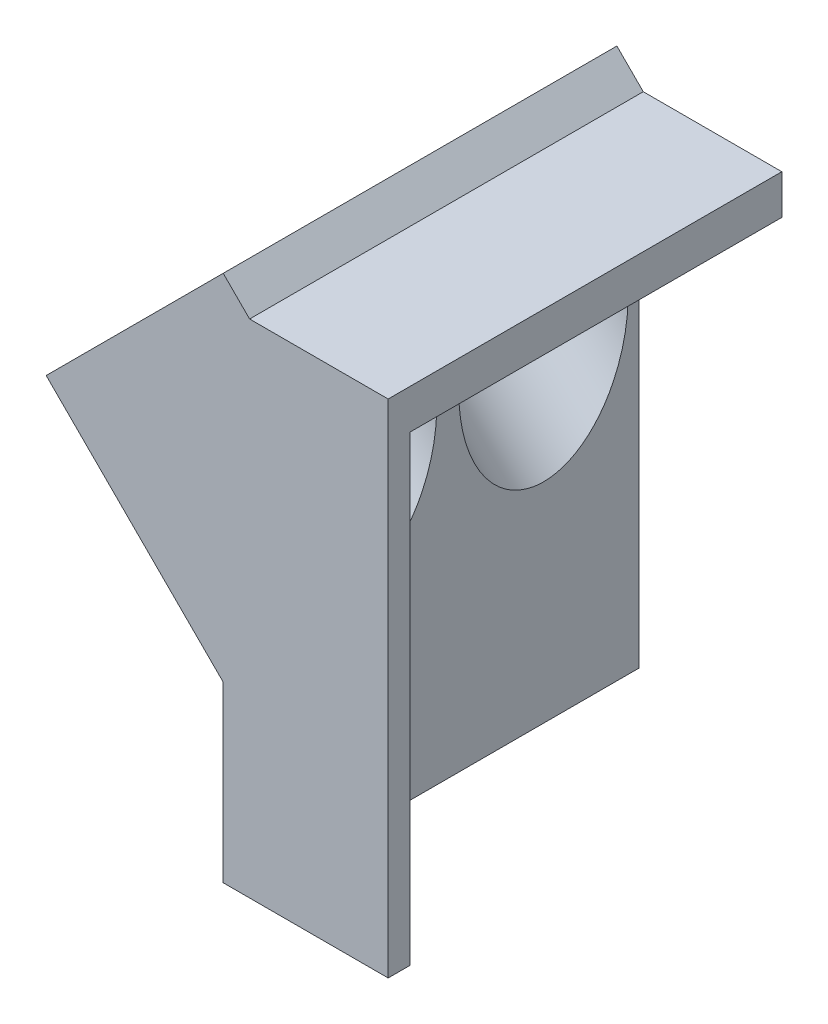
ISO-10303-21;
HEADER;
FILE_DESCRIPTION(('STEP AP214'),'2;1');
FILE_NAME('part.step','',(''),(''),'','','');
FILE_SCHEMA(('AUTOMOTIVE_DESIGN { 1 0 10303 214 1 1 1 1 }'));
ENDSEC;
DATA;
#1=APPLICATION_CONTEXT('core data for automotive mechanical design processes');
#2=APPLICATION_PROTOCOL_DEFINITION('international standard','automotive_design',2000,#1);
#3=PRODUCT_CONTEXT('',#1,'mechanical');
#4=PRODUCT('Part','Part','',(#3));
#5=PRODUCT_RELATED_PRODUCT_CATEGORY('part','',(#4));
#6=PRODUCT_DEFINITION_FORMATION('','',#4);
#7=PRODUCT_DEFINITION_CONTEXT('part definition',#1,'design');
#8=PRODUCT_DEFINITION('design','',#6,#7);
#9=PRODUCT_DEFINITION_SHAPE('','',#8);
#10=(LENGTH_UNIT() NAMED_UNIT(*) SI_UNIT(.MILLI.,.METRE.));
#11=(NAMED_UNIT(*) PLANE_ANGLE_UNIT() SI_UNIT($,.RADIAN.));
#12=(NAMED_UNIT(*) SI_UNIT($,.STERADIAN.) SOLID_ANGLE_UNIT());
#13=UNCERTAINTY_MEASURE_WITH_UNIT(LENGTH_MEASURE(1.E-05),#10,'distance_accuracy_value','');
#14=(GEOMETRIC_REPRESENTATION_CONTEXT(3) GLOBAL_UNCERTAINTY_ASSIGNED_CONTEXT((#13)) GLOBAL_UNIT_ASSIGNED_CONTEXT((#10,
#11,#12)) REPRESENTATION_CONTEXT('',''));
#15=CARTESIAN_POINT('',(0.,0.,0.));
#16=DIRECTION('',(0.,0.,1.));
#17=DIRECTION('',(1.,0.,0.));
#18=AXIS2_PLACEMENT_3D('',#15,#16,#17);
#19=CARTESIAN_POINT('',(103.,0.,0.));
#20=DIRECTION('',(1.,0.,0.));
#21=DIRECTION('',(0.,0.,-1.));
#22=AXIS2_PLACEMENT_3D('',#19,#20,#21);
#23=PLANE('',#22);
#24=DIRECTION('',(0.,0.,1.));
#25=VECTOR('',#24,1.);
#26=CARTESIAN_POINT('',(103.,-150.,0.));
#27=LINE('',#26,#25);
#28=CARTESIAN_POINT('',(103.,-150.,169.));
#29=VERTEX_POINT('',#28);
#30=CARTESIAN_POINT('',(103.,-150.,179.));
#31=VERTEX_POINT('',#30);
#32=EDGE_CURVE('E136',#29,#31,#27,.T.);
#33=ORIENTED_EDGE('',*,*,#32,.F.);
#34=DIRECTION('',(0.,1.,0.));
#35=VECTOR('',#34,1.);
#36=CARTESIAN_POINT('',(103.,60.0000000000001,169.));
#37=LINE('',#36,#35);
#38=CARTESIAN_POINT('',(103.,60.0000000000001,169.));
#39=VERTEX_POINT('',#38);
#40=EDGE_CURVE('E137',#29,#39,#37,.T.);
#41=ORIENTED_EDGE('',*,*,#40,.T.);
#42=DIRECTION('',(0.,0.,1.));
#43=VECTOR('',#42,1.);
#44=CARTESIAN_POINT('',(103.,60.0000000000001,0.));
#45=LINE('',#44,#43);
#46=CARTESIAN_POINT('',(103.,60.0000000000001,0.));
#47=VERTEX_POINT('',#46);
#48=EDGE_CURVE('E135',#47,#39,#45,.T.);
#49=ORIENTED_EDGE('',*,*,#48,.F.);
#50=DIRECTION('',(0.,-1.,0.));
#51=VECTOR('',#50,1.);
#52=CARTESIAN_POINT('',(103.,0.,0.));
#53=LINE('',#52,#51);
#54=CARTESIAN_POINT('',(103.,78.0000000000001,0.));
#55=VERTEX_POINT('',#54);
#56=EDGE_CURVE('E122',#55,#47,#53,.T.);
#57=ORIENTED_EDGE('',*,*,#56,.F.);
#58=DIRECTION('',(0.,0.,1.));
#59=VECTOR('',#58,1.);
#60=CARTESIAN_POINT('',(103.,78.0000000000001,0.));
#61=LINE('',#60,#59);
#62=CARTESIAN_POINT('',(103.,78.0000000000001,179.));
#63=VERTEX_POINT('',#62);
#64=EDGE_CURVE('E133',#55,#63,#61,.T.);
#65=ORIENTED_EDGE('',*,*,#64,.T.);
#66=DIRECTION('',(0.,-1.,0.));
#67=VECTOR('',#66,1.);
#68=CARTESIAN_POINT('',(103.,90.0000000000001,179.));
#69=LINE('',#68,#67);
#70=EDGE_CURVE('E143',#63,#31,#69,.T.);
#71=ORIENTED_EDGE('',*,*,#70,.T.);
#72=EDGE_LOOP('',(#33,#41,#49,#57,#65,#71));
#73=FACE_BOUND('',#72,.T.);
#74=ADVANCED_FACE('F42',(#73),#23,.T.);
#75=CARTESIAN_POINT('',(0.,0.,0.));
#76=DIRECTION('',(0.,0.,-1.));
#77=DIRECTION('',(-1.,0.,0.));
#78=AXIS2_PLACEMENT_3D('',#75,#76,#77);
#79=PLANE('',#78);
#80=DIRECTION('',(1.,0.,0.));
#81=VECTOR('',#80,1.);
#82=CARTESIAN_POINT('',(0.,78.0000000000001,0.));
#83=LINE('',#82,#81);
#84=CARTESIAN_POINT('',(39.9999999999998,78.0000000000001,0.));
#85=VERTEX_POINT('',#84);
#86=EDGE_CURVE('E11',#85,#55,#83,.T.);
#87=ORIENTED_EDGE('',*,*,#86,.T.);
#88=ORIENTED_EDGE('',*,*,#56,.T.);
#89=DIRECTION('',(1.,0.,0.));
#90=VECTOR('',#89,1.);
#91=CARTESIAN_POINT('',(0.,60.0000000000001,0.));
#92=LINE('',#91,#90);
#93=CARTESIAN_POINT('',(38.,60.0000000000001,0.));
#94=VERTEX_POINT('',#93);
#95=EDGE_CURVE('E160',#94,#47,#92,.T.);
#96=ORIENTED_EDGE('',*,*,#95,.F.);
#97=DIRECTION('',(0.,1.,0.));
#98=VECTOR('',#97,1.);
#99=CARTESIAN_POINT('',(38.,60.0000000000001,0.));
#100=LINE('',#99,#98);
#101=CARTESIAN_POINT('',(38.,-150.,0.));
#102=VERTEX_POINT('',#101);
#103=EDGE_CURVE('E161',#102,#94,#100,.T.);
#104=ORIENTED_EDGE('',*,*,#103,.F.);
#105=DIRECTION('',(1.,0.,0.));
#106=VECTOR('',#105,1.);
#107=CARTESIAN_POINT('',(0.,-150.,0.));
#108=LINE('',#107,#106);
#109=CARTESIAN_POINT('',(28.,-150.,0.));
#110=VERTEX_POINT('',#109);
#111=EDGE_CURVE('E163',#110,#102,#108,.T.);
#112=ORIENTED_EDGE('',*,*,#111,.F.);
#113=DIRECTION('',(0.,-1.,0.));
#114=VECTOR('',#113,1.);
#115=CARTESIAN_POINT('',(28.,-150.,0.));
#116=LINE('',#115,#114);
#117=CARTESIAN_POINT('',(28.,-71.0000000000006,0.));
#118=VERTEX_POINT('',#117);
#119=EDGE_CURVE('E173',#118,#110,#116,.T.);
#120=ORIENTED_EDGE('',*,*,#119,.F.);
#121=DIRECTION('',(0.707106781186551,-0.707106781186544,0.));
#122=VECTOR('',#121,1.);
#123=CARTESIAN_POINT('',(-55.0000000000015,12.,0.));
#124=LINE('',#123,#122);
#125=CARTESIAN_POINT('',(-52.5000000000008,9.49999999999929,0.));
#126=VERTEX_POINT('',#125);
#127=EDGE_CURVE('E50',#118,#126,#124,.F.);
#128=ORIENTED_EDGE('',*,*,#127,.T.);
#129=DIRECTION('',(0.707106781186548,0.707106781186548,0.));
#130=VECTOR('',#129,1.);
#131=CARTESIAN_POINT('',(-50.,12.0000000000001,0.));
#132=LINE('',#131,#130);
#133=CARTESIAN_POINT('',(28.,90.0000000000001,0.));
#134=VERTEX_POINT('',#133);
#135=EDGE_CURVE('E165',#134,#126,#132,.F.);
#136=ORIENTED_EDGE('',*,*,#135,.F.);
#137=DIRECTION('',(0.707106781186544,-0.707106781186551,0.));
#138=VECTOR('',#137,1.);
#139=CARTESIAN_POINT('',(41.,76.9999999999998,0.));
#140=LINE('',#139,#138);
#141=EDGE_CURVE('E125',#85,#134,#140,.F.);
#142=ORIENTED_EDGE('',*,*,#141,.F.);
#143=EDGE_LOOP('',(#87,#88,#96,#104,#112,#120,#128,#136,#142));
#144=FACE_BOUND('',#143,.T.);
#145=ADVANCED_FACE('F121',(#144),#79,.T.);
#146=CARTESIAN_POINT('',(0.,-150.,0.));
#147=DIRECTION('',(0.,-1.,0.));
#148=DIRECTION('',(0.,0.,-1.));
#149=AXIS2_PLACEMENT_3D('',#146,#147,#148);
#150=PLANE('',#149);
#151=DIRECTION('',(-1.,0.,0.));
#152=VECTOR('',#151,1.);
#153=CARTESIAN_POINT('',(0.,-150.,169.));
#154=LINE('',#153,#152);
#155=CARTESIAN_POINT('',(38.,-150.,169.));
#156=VERTEX_POINT('',#155);
#157=EDGE_CURVE('E148',#29,#156,#154,.T.);
#158=ORIENTED_EDGE('',*,*,#157,.F.);
#159=ORIENTED_EDGE('',*,*,#32,.T.);
#160=DIRECTION('',(1.,0.,0.));
#161=VECTOR('',#160,1.);
#162=CARTESIAN_POINT('',(28.,-150.,179.));
#163=LINE('',#162,#161);
#164=CARTESIAN_POINT('',(28.,-150.,179.));
#165=VERTEX_POINT('',#164);
#166=EDGE_CURVE('E156',#165,#31,#163,.T.);
#167=ORIENTED_EDGE('',*,*,#166,.F.);
#168=DIRECTION('',(0.,0.,1.));
#169=VECTOR('',#168,1.);
#170=CARTESIAN_POINT('',(28.,-150.,-179.));
#171=LINE('',#170,#169);
#172=EDGE_CURVE('E159',#110,#165,#171,.T.);
#173=ORIENTED_EDGE('',*,*,#172,.F.);
#174=ORIENTED_EDGE('',*,*,#111,.T.);
#175=DIRECTION('',(0.,0.,1.));
#176=VECTOR('',#175,1.);
#177=CARTESIAN_POINT('',(38.,-150.,0.));
#178=LINE('',#177,#176);
#179=EDGE_CURVE('E151',#102,#156,#178,.T.);
#180=ORIENTED_EDGE('',*,*,#179,.T.);
#181=EDGE_LOOP('',(#158,#159,#167,#173,#174,#180));
#182=FACE_BOUND('',#181,.T.);
#183=ADVANCED_FACE('F236',(#182),#150,.T.);
#184=CARTESIAN_POINT('',(0.,60.0000000000001,169.));
#185=DIRECTION('',(0.,0.,1.));
#186=DIRECTION('',(1.,0.,0.));
#187=AXIS2_PLACEMENT_3D('',#184,#185,#186);
#188=PLANE('',#187);
#189=ORIENTED_EDGE('',*,*,#40,.F.);
#190=ORIENTED_EDGE('',*,*,#157,.T.);
#191=DIRECTION('',(0.,-1.,0.));
#192=VECTOR('',#191,1.);
#193=CARTESIAN_POINT('',(38.,60.0000000000001,169.));
#194=LINE('',#193,#192);
#195=CARTESIAN_POINT('',(38.,60.0000000000001,169.));
#196=VERTEX_POINT('',#195);
#197=EDGE_CURVE('E154',#196,#156,#194,.T.);
#198=ORIENTED_EDGE('',*,*,#197,.F.);
#199=DIRECTION('',(-1.,0.,0.));
#200=VECTOR('',#199,1.);
#201=CARTESIAN_POINT('',(0.,60.0000000000001,169.));
#202=LINE('',#201,#200);
#203=EDGE_CURVE('E152',#39,#196,#202,.T.);
#204=ORIENTED_EDGE('',*,*,#203,.F.);
#205=EDGE_LOOP('',(#189,#190,#198,#204));
#206=FACE_BOUND('',#205,.T.);
#207=ADVANCED_FACE('F213',(#206),#188,.F.);
#208=CARTESIAN_POINT('',(0.,60.0000000000001,0.));
#209=DIRECTION('',(0.,-1.,0.));
#210=DIRECTION('',(0.,0.,-1.));
#211=AXIS2_PLACEMENT_3D('',#208,#209,#210);
#212=PLANE('',#211);
#213=ORIENTED_EDGE('',*,*,#95,.T.);
#214=ORIENTED_EDGE('',*,*,#48,.T.);
#215=ORIENTED_EDGE('',*,*,#203,.T.);
#216=DIRECTION('',(0.,0.,1.));
#217=VECTOR('',#216,1.);
#218=CARTESIAN_POINT('',(38.,60.0000000000001,0.));
#219=LINE('',#218,#217);
#220=EDGE_CURVE('E150',#94,#196,#219,.T.);
#221=ORIENTED_EDGE('',*,*,#220,.F.);
#222=EDGE_LOOP('',(#213,#214,#215,#221));
#223=FACE_BOUND('',#222,.T.);
#224=ADVANCED_FACE('F44',(#223),#212,.T.);
#225=CARTESIAN_POINT('',(-50.,90.0000000000001,179.));
#226=DIRECTION('',(0.,0.,-1.));
#227=DIRECTION('',(-1.,0.,0.));
#228=AXIS2_PLACEMENT_3D('',#225,#226,#227);
#229=PLANE('',#228);
#230=ORIENTED_EDGE('',*,*,#70,.F.);
#231=DIRECTION('',(1.,0.,0.));
#232=VECTOR('',#231,1.);
#233=CARTESIAN_POINT('',(41.,78.0000000000001,179.));
#234=LINE('',#233,#232);
#235=CARTESIAN_POINT('',(39.9999999999998,78.0000000000001,179.));
#236=VERTEX_POINT('',#235);
#237=EDGE_CURVE('E141',#236,#63,#234,.T.);
#238=ORIENTED_EDGE('',*,*,#237,.F.);
#239=DIRECTION('',(0.707106781186544,-0.707106781186551,0.));
#240=VECTOR('',#239,1.);
#241=CARTESIAN_POINT('',(41.,76.9999999999998,179.));
#242=LINE('',#241,#240);
#243=CARTESIAN_POINT('',(28.,90.0000000000001,179.));
#244=VERTEX_POINT('',#243);
#245=EDGE_CURVE('E202',#236,#244,#242,.F.);
#246=ORIENTED_EDGE('',*,*,#245,.T.);
#247=DIRECTION('',(0.707106781186548,0.707106781186548,0.));
#248=VECTOR('',#247,1.);
#249=CARTESIAN_POINT('',(-50.,12.0000000000001,179.));
#250=LINE('',#249,#248);
#251=CARTESIAN_POINT('',(-52.5000000000008,9.49999999999929,179.));
#252=VERTEX_POINT('',#251);
#253=EDGE_CURVE('E197',#244,#252,#250,.F.);
#254=ORIENTED_EDGE('',*,*,#253,.T.);
#255=DIRECTION('',(-0.707106781186551,0.707106781186544,0.));
#256=VECTOR('',#255,1.);
#257=CARTESIAN_POINT('',(-91.5000000000008,48.4999999999989,179.));
#258=LINE('',#257,#256);
#259=CARTESIAN_POINT('',(28.,-71.0000000000006,179.));
#260=VERTEX_POINT('',#259);
#261=EDGE_CURVE('E200',#252,#260,#258,.F.);
#262=ORIENTED_EDGE('',*,*,#261,.T.);
#263=DIRECTION('',(0.,1.,0.));
#264=VECTOR('',#263,1.);
#265=CARTESIAN_POINT('',(28.,-150.,179.));
#266=LINE('',#265,#264);
#267=EDGE_CURVE('E194',#165,#260,#266,.T.);
#268=ORIENTED_EDGE('',*,*,#267,.F.);
#269=ORIENTED_EDGE('',*,*,#166,.T.);
#270=EDGE_LOOP('',(#230,#238,#246,#254,#262,#268,#269));
#271=FACE_BOUND('',#270,.T.);
#272=ADVANCED_FACE('F228',(#271),#229,.F.);
#273=CARTESIAN_POINT('',(0.,78.0000000000001,0.));
#274=DIRECTION('',(0.,-1.,0.));
#275=DIRECTION('',(0.,0.,-1.));
#276=AXIS2_PLACEMENT_3D('',#273,#274,#275);
#277=PLANE('',#276);
#278=ORIENTED_EDGE('',*,*,#64,.F.);
#279=ORIENTED_EDGE('',*,*,#86,.F.);
#280=DIRECTION('',(0.,0.,-1.));
#281=VECTOR('',#280,1.);
#282=CARTESIAN_POINT('',(39.9999999999998,78.0000000000001,0.));
#283=LINE('',#282,#281);
#284=EDGE_CURVE('E162',#85,#236,#283,.F.);
#285=ORIENTED_EDGE('',*,*,#284,.T.);
#286=ORIENTED_EDGE('',*,*,#237,.T.);
#287=EDGE_LOOP('',(#278,#279,#285,#286));
#288=FACE_BOUND('',#287,.T.);
#289=ADVANCED_FACE('F139',(#288),#277,.F.);
#290=CARTESIAN_POINT('',(69.0672798364522,-31.5672798364537,43.3627691569844));
#291=DIRECTION('',(-0.707106781186548,0.707106781186547,0.));
#292=DIRECTION('',(-0.707106781186547,-0.707106781186548,0.));
#293=AXIS2_PLACEMENT_3D('',#290,#291,#292);
#294=CYLINDRICAL_SURFACE('',#293,38.5);
#295=CARTESIAN_POINT('',(-12.2500000000008,49.7499999999993,43.3627691569844));
#296=DIRECTION('',(-0.707106781186548,0.707106781186547,0.));
#297=DIRECTION('',(-0.707106781186547,-0.707106781186548,0.));
#298=AXIS2_PLACEMENT_3D('',#295,#296,#297);
#299=CIRCLE('',#298,38.5);
#300=CARTESIAN_POINT('',(-39.4736110756829,22.5263889243172,43.3627691569844));
#301=VERTEX_POINT('',#300);
#302=EDGE_CURVE('E189',#301,#301,#299,.T.);
#303=ORIENTED_EDGE('',*,*,#302,.T.);
#304=EDGE_LOOP('',(#303));
#305=FACE_BOUND('',#304,.T.);
#306=CARTESIAN_POINT('',(38.,-0.500000000001534,43.3627691569844));
#307=DIRECTION('',(1.,0.,0.));
#308=DIRECTION('',(0.,1.,0.));
#309=AXIS2_PLACEMENT_3D('',#306,#307,#308);
#310=ELLIPSE('',#309,54.4472221513642,38.5);
#311=CARTESIAN_POINT('',(38.,53.9472221513626,43.3627691569844));
#312=VERTEX_POINT('',#311);
#313=EDGE_CURVE('E186',#312,#312,#310,.F.);
#314=ORIENTED_EDGE('',*,*,#313,.F.);
#315=EDGE_LOOP('',(#314));
#316=FACE_BOUND('',#315,.T.);
#317=ADVANCED_FACE('F249',(#305,#316),#294,.F.);
#318=CARTESIAN_POINT('',(69.0672798364526,-31.5672798364533,130.362769156984));
#319=DIRECTION('',(-0.707106781186548,0.707106781186547,0.));
#320=DIRECTION('',(-0.707106781186547,-0.707106781186548,0.));
#321=AXIS2_PLACEMENT_3D('',#318,#319,#320);
#322=CYLINDRICAL_SURFACE('',#321,38.5);
#323=CARTESIAN_POINT('',(-12.2500000000004,49.7499999999997,130.362769156984));
#324=DIRECTION('',(-0.707106781186548,0.707106781186547,0.));
#325=DIRECTION('',(-0.707106781186547,-0.707106781186548,0.));
#326=AXIS2_PLACEMENT_3D('',#323,#324,#325);
#327=CIRCLE('',#326,38.5);
#328=CARTESIAN_POINT('',(-39.4736110756825,22.5263889243176,130.362769156984));
#329=VERTEX_POINT('',#328);
#330=EDGE_CURVE('E157',#329,#329,#327,.T.);
#331=ORIENTED_EDGE('',*,*,#330,.T.);
#332=EDGE_LOOP('',(#331));
#333=FACE_BOUND('',#332,.T.);
#334=CARTESIAN_POINT('',(38.,-0.500000000000673,130.362769156984));
#335=DIRECTION('',(1.,0.,0.));
#336=DIRECTION('',(0.,1.,0.));
#337=AXIS2_PLACEMENT_3D('',#334,#335,#336);
#338=ELLIPSE('',#337,54.4472221513642,38.5);
#339=CARTESIAN_POINT('',(38.,53.9472221513635,130.362769156984));
#340=VERTEX_POINT('',#339);
#341=EDGE_CURVE('E185',#340,#340,#338,.F.);
#342=ORIENTED_EDGE('',*,*,#341,.F.);
#343=EDGE_LOOP('',(#342));
#344=FACE_BOUND('',#343,.T.);
#345=ADVANCED_FACE('F253',(#333,#344),#322,.F.);
#346=CARTESIAN_POINT('',(38.,60.0000000000001,0.));
#347=DIRECTION('',(1.,0.,0.));
#348=DIRECTION('',(0.,0.,-1.));
#349=AXIS2_PLACEMENT_3D('',#346,#347,#348);
#350=PLANE('',#349);
#351=ORIENTED_EDGE('',*,*,#341,.T.);
#352=EDGE_LOOP('',(#351));
#353=FACE_BOUND('',#352,.T.);
#354=ORIENTED_EDGE('',*,*,#313,.T.);
#355=EDGE_LOOP('',(#354));
#356=FACE_BOUND('',#355,.T.);
#357=ORIENTED_EDGE('',*,*,#179,.F.);
#358=ORIENTED_EDGE('',*,*,#103,.T.);
#359=ORIENTED_EDGE('',*,*,#220,.T.);
#360=ORIENTED_EDGE('',*,*,#197,.T.);
#361=EDGE_LOOP('',(#357,#358,#359,#360));
#362=FACE_BOUND('',#361,.T.);
#363=ADVANCED_FACE('F218',(#353,#356,#362),#350,.T.);
#364=CARTESIAN_POINT('',(-50.,12.0000000000001,179.));
#365=DIRECTION('',(0.707106781186548,-0.707106781186548,0.));
#366=DIRECTION('',(0.,0.,-1.));
#367=AXIS2_PLACEMENT_3D('',#364,#365,#366);
#368=PLANE('',#367);
#369=ORIENTED_EDGE('',*,*,#302,.F.);
#370=EDGE_LOOP('',(#369));
#371=FACE_BOUND('',#370,.T.);
#372=ORIENTED_EDGE('',*,*,#330,.F.);
#373=EDGE_LOOP('',(#372));
#374=FACE_BOUND('',#373,.T.);
#375=DIRECTION('',(0.,0.,1.));
#376=VECTOR('',#375,1.);
#377=CARTESIAN_POINT('',(28.,90.0000000000001,0.));
#378=LINE('',#377,#376);
#379=EDGE_CURVE('E196',#134,#244,#378,.T.);
#380=ORIENTED_EDGE('',*,*,#379,.F.);
#381=ORIENTED_EDGE('',*,*,#135,.T.);
#382=DIRECTION('',(0.,0.,1.));
#383=VECTOR('',#382,1.);
#384=CARTESIAN_POINT('',(-52.5000000000008,9.49999999999929,0.));
#385=LINE('',#384,#383);
#386=EDGE_CURVE('E65',#126,#252,#385,.T.);
#387=ORIENTED_EDGE('',*,*,#386,.T.);
#388=ORIENTED_EDGE('',*,*,#253,.F.);
#389=EDGE_LOOP('',(#380,#381,#387,#388));
#390=FACE_BOUND('',#389,.T.);
#391=ADVANCED_FACE('F231',(#371,#374,#390),#368,.F.);
#392=CARTESIAN_POINT('',(41.,76.9999999999998,179.));
#393=DIRECTION('',(-0.707106781186551,-0.707106781186544,0.));
#394=DIRECTION('',(0.,0.,1.));
#395=AXIS2_PLACEMENT_3D('',#392,#393,#394);
#396=PLANE('',#395);
#397=ORIENTED_EDGE('',*,*,#284,.F.);
#398=ORIENTED_EDGE('',*,*,#141,.T.);
#399=ORIENTED_EDGE('',*,*,#379,.T.);
#400=ORIENTED_EDGE('',*,*,#245,.F.);
#401=EDGE_LOOP('',(#397,#398,#399,#400));
#402=FACE_BOUND('',#401,.T.);
#403=ADVANCED_FACE('F230',(#402),#396,.F.);
#404=CARTESIAN_POINT('',(28.,-150.,-179.));
#405=DIRECTION('',(-1.,0.,0.));
#406=DIRECTION('',(0.,0.,1.));
#407=AXIS2_PLACEMENT_3D('',#404,#405,#406);
#408=PLANE('',#407);
#409=DIRECTION('',(0.,0.,-1.));
#410=VECTOR('',#409,1.);
#411=CARTESIAN_POINT('',(28.,-71.0000000000006,-179.));
#412=LINE('',#411,#410);
#413=EDGE_CURVE('E57',#260,#118,#412,.T.);
#414=ORIENTED_EDGE('',*,*,#413,.T.);
#415=ORIENTED_EDGE('',*,*,#119,.T.);
#416=ORIENTED_EDGE('',*,*,#172,.T.);
#417=ORIENTED_EDGE('',*,*,#267,.T.);
#418=EDGE_LOOP('',(#414,#415,#416,#417));
#419=FACE_BOUND('',#418,.T.);
#420=ADVANCED_FACE('F234',(#419),#408,.T.);
#421=CARTESIAN_POINT('',(-55.0000000000015,12.,0.));
#422=DIRECTION('',(-0.707106781186544,-0.707106781186551,0.));
#423=DIRECTION('',(0.,0.,-1.));
#424=AXIS2_PLACEMENT_3D('',#421,#422,#423);
#425=PLANE('',#424);
#426=ORIENTED_EDGE('',*,*,#127,.F.);
#427=ORIENTED_EDGE('',*,*,#413,.F.);
#428=ORIENTED_EDGE('',*,*,#261,.F.);
#429=ORIENTED_EDGE('',*,*,#386,.F.);
#430=EDGE_LOOP('',(#426,#427,#428,#429));
#431=FACE_BOUND('',#430,.T.);
#432=ADVANCED_FACE('F233',(#431),#425,.T.);
#433=CLOSED_SHELL('',(#74,#145,#183,#207,#224,#272,#289,#317,#345,#363,#391,#403,#420,#432));
#434=MANIFOLD_SOLID_BREP('B2',#433);
#435=ADVANCED_BREP_SHAPE_REPRESENTATION('',(#18,#434),#14);
#436=SHAPE_DEFINITION_REPRESENTATION(#9,#435);
ENDSEC;
END-ISO-10303-21;
